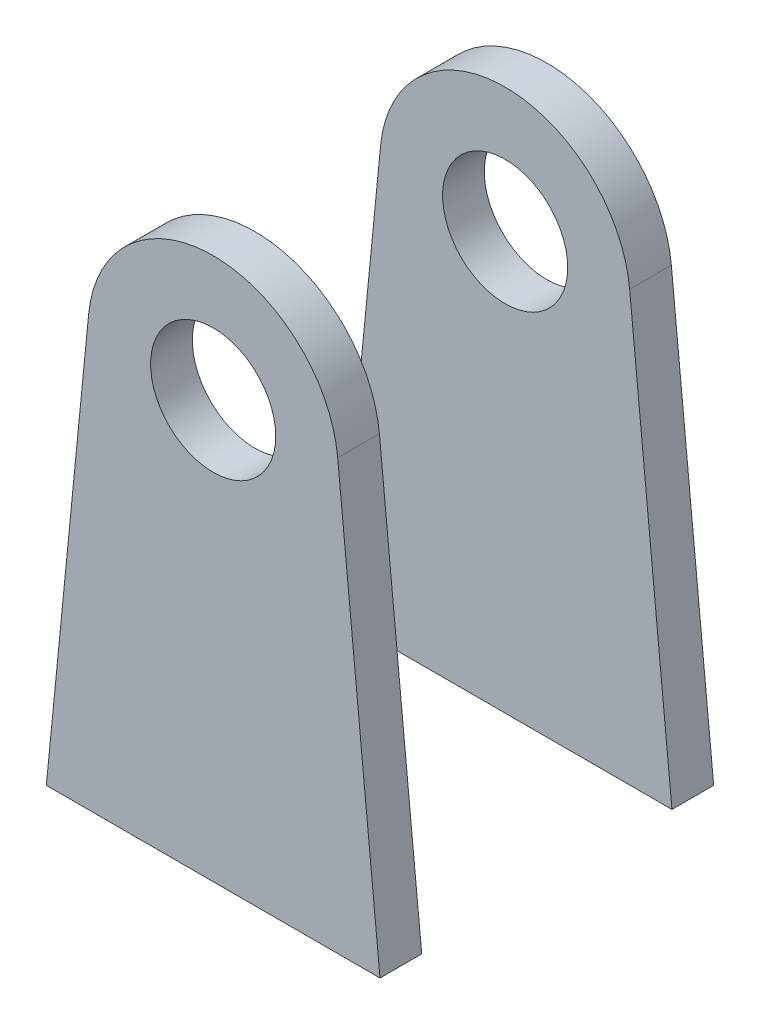
ISO-10303-21;
HEADER;
FILE_DESCRIPTION(('STEP AP214'),'2;1');
FILE_NAME('part.step','',(''),(''),'','','');
FILE_SCHEMA(('AUTOMOTIVE_DESIGN { 1 0 10303 214 1 1 1 1 }'));
ENDSEC;
DATA;
#1=APPLICATION_CONTEXT('core data for automotive mechanical design processes');
#2=APPLICATION_PROTOCOL_DEFINITION('international standard','automotive_design',2000,#1);
#3=PRODUCT_CONTEXT('',#1,'mechanical');
#4=PRODUCT('Part','Part','',(#3));
#5=PRODUCT_RELATED_PRODUCT_CATEGORY('part','',(#4));
#6=PRODUCT_DEFINITION_FORMATION('','',#4);
#7=PRODUCT_DEFINITION_CONTEXT('part definition',#1,'design');
#8=PRODUCT_DEFINITION('design','',#6,#7);
#9=PRODUCT_DEFINITION_SHAPE('','',#8);
#10=(LENGTH_UNIT() NAMED_UNIT(*) SI_UNIT(.MILLI.,.METRE.));
#11=(NAMED_UNIT(*) PLANE_ANGLE_UNIT() SI_UNIT($,.RADIAN.));
#12=(NAMED_UNIT(*) SI_UNIT($,.STERADIAN.) SOLID_ANGLE_UNIT());
#13=UNCERTAINTY_MEASURE_WITH_UNIT(LENGTH_MEASURE(1.E-05),#10,'distance_accuracy_value','');
#14=(GEOMETRIC_REPRESENTATION_CONTEXT(3) GLOBAL_UNCERTAINTY_ASSIGNED_CONTEXT((#13)) GLOBAL_UNIT_ASSIGNED_CONTEXT((#10,
#11,#12)) REPRESENTATION_CONTEXT('',''));
#15=CARTESIAN_POINT('',(0.,0.,0.));
#16=DIRECTION('',(0.,0.,1.));
#17=DIRECTION('',(1.,0.,0.));
#18=AXIS2_PLACEMENT_3D('',#15,#16,#17);
#19=CARTESIAN_POINT('',(-9.47908328640615,0.934133314562462,-9.525));
#20=DIRECTION('',(0.99517934765419,-0.0980717390616758,0.));
#21=DIRECTION('',(0.0980717390616758,0.99517934765419,0.));
#22=AXIS2_PLACEMENT_3D('',#19,#20,#21);
#23=PLANE('',#22);
#24=DIRECTION('',(-0.0980717390616758,-0.99517934765419,0.));
#25=VECTOR('',#24,1.);
#26=CARTESIAN_POINT('',(-9.47908328640615,0.934133314562462,-12.7));
#27=LINE('',#26,#25);
#28=CARTESIAN_POINT('',(-9.47908328640615,0.934133314562462,-12.7));
#29=VERTEX_POINT('',#28);
#30=CARTESIAN_POINT('',(-12.7,-31.75,-12.7));
#31=VERTEX_POINT('',#30);
#32=EDGE_CURVE('E129',#29,#31,#27,.T.);
#33=ORIENTED_EDGE('',*,*,#32,.T.);
#34=DIRECTION('',(0.,0.,-1.));
#35=VECTOR('',#34,1.);
#36=CARTESIAN_POINT('',(-12.7,-31.75,-9.525));
#37=LINE('',#36,#35);
#38=CARTESIAN_POINT('',(-12.7,-31.75,-9.525));
#39=VERTEX_POINT('',#38);
#40=EDGE_CURVE('E12',#39,#31,#37,.T.);
#41=ORIENTED_EDGE('',*,*,#40,.F.);
#42=DIRECTION('',(-0.0980717390616758,-0.99517934765419,0.));
#43=VECTOR('',#42,1.);
#44=CARTESIAN_POINT('',(-9.47908328640615,0.934133314562462,-9.525));
#45=LINE('',#44,#43);
#46=CARTESIAN_POINT('',(-9.47908328640615,0.934133314562462,-9.525));
#47=VERTEX_POINT('',#46);
#48=EDGE_CURVE('E106',#47,#39,#45,.T.);
#49=ORIENTED_EDGE('',*,*,#48,.F.);
#50=DIRECTION('',(0.,0.,-1.));
#51=VECTOR('',#50,1.);
#52=CARTESIAN_POINT('',(-9.47908328640615,0.934133314562462,-9.525));
#53=LINE('',#52,#51);
#54=EDGE_CURVE('E128',#47,#29,#53,.T.);
#55=ORIENTED_EDGE('',*,*,#54,.T.);
#56=EDGE_LOOP('',(#33,#41,#49,#55));
#57=FACE_BOUND('',#56,.T.);
#58=ADVANCED_FACE('F57',(#57),#23,.F.);
#59=CARTESIAN_POINT('',(0.,-31.75,-9.525));
#60=DIRECTION('',(0.,1.,0.));
#61=DIRECTION('',(0.,0.,1.));
#62=AXIS2_PLACEMENT_3D('',#59,#60,#61);
#63=PLANE('',#62);
#64=DIRECTION('',(1.,0.,0.));
#65=VECTOR('',#64,1.);
#66=CARTESIAN_POINT('',(0.,-31.75,-12.7));
#67=LINE('',#66,#65);
#68=CARTESIAN_POINT('',(12.7,-31.75,-12.7));
#69=VERTEX_POINT('',#68);
#70=EDGE_CURVE('E112',#31,#69,#67,.T.);
#71=ORIENTED_EDGE('',*,*,#70,.T.);
#72=DIRECTION('',(0.,0.,-1.));
#73=VECTOR('',#72,1.);
#74=CARTESIAN_POINT('',(12.7,-31.75,-9.525));
#75=LINE('',#74,#73);
#76=CARTESIAN_POINT('',(12.7,-31.75,-9.525));
#77=VERTEX_POINT('',#76);
#78=EDGE_CURVE('E66',#77,#69,#75,.T.);
#79=ORIENTED_EDGE('',*,*,#78,.F.);
#80=DIRECTION('',(1.,0.,0.));
#81=VECTOR('',#80,1.);
#82=CARTESIAN_POINT('',(0.,-31.75,-9.525));
#83=LINE('',#82,#81);
#84=EDGE_CURVE('E100',#39,#77,#83,.T.);
#85=ORIENTED_EDGE('',*,*,#84,.F.);
#86=ORIENTED_EDGE('',*,*,#40,.T.);
#87=EDGE_LOOP('',(#71,#79,#85,#86));
#88=FACE_BOUND('',#87,.T.);
#89=ADVANCED_FACE('F111',(#88),#63,.F.);
#90=CARTESIAN_POINT('',(9.47908328640615,0.934133314562464,-9.525));
#91=DIRECTION('',(0.99517934765419,0.098071739061676,0.));
#92=DIRECTION('',(-0.098071739061676,0.99517934765419,0.));
#93=AXIS2_PLACEMENT_3D('',#90,#91,#92);
#94=PLANE('',#93);
#95=DIRECTION('',(0.098071739061676,-0.99517934765419,0.));
#96=VECTOR('',#95,1.);
#97=CARTESIAN_POINT('',(9.47908328640615,0.934133314562464,-12.7));
#98=LINE('',#97,#96);
#99=CARTESIAN_POINT('',(9.47908328640615,0.934133314562464,-12.7));
#100=VERTEX_POINT('',#99);
#101=EDGE_CURVE('E135',#100,#69,#98,.T.);
#102=ORIENTED_EDGE('',*,*,#101,.F.);
#103=DIRECTION('',(0.,0.,-1.));
#104=VECTOR('',#103,1.);
#105=CARTESIAN_POINT('',(9.47908328640615,0.934133314562464,-9.525));
#106=LINE('',#105,#104);
#107=CARTESIAN_POINT('',(9.47908328640615,0.934133314562464,-9.525));
#108=VERTEX_POINT('',#107);
#109=EDGE_CURVE('E90',#108,#100,#106,.T.);
#110=ORIENTED_EDGE('',*,*,#109,.F.);
#111=DIRECTION('',(0.098071739061676,-0.99517934765419,0.));
#112=VECTOR('',#111,1.);
#113=CARTESIAN_POINT('',(9.47908328640615,0.934133314562464,-9.525));
#114=LINE('',#113,#112);
#115=EDGE_CURVE('E104',#108,#77,#114,.T.);
#116=ORIENTED_EDGE('',*,*,#115,.T.);
#117=ORIENTED_EDGE('',*,*,#78,.T.);
#118=EDGE_LOOP('',(#102,#110,#116,#117));
#119=FACE_BOUND('',#118,.T.);
#120=ADVANCED_FACE('F117',(#119),#94,.T.);
#121=CARTESIAN_POINT('',(0.,0.,-9.525));
#122=DIRECTION('',(0.,0.,-1.));
#123=DIRECTION('',(-1.,0.,0.));
#124=AXIS2_PLACEMENT_3D('',#121,#122,#123);
#125=CYLINDRICAL_SURFACE('',#124,9.525);
#126=CARTESIAN_POINT('',(0.,0.,-12.7));
#127=DIRECTION('',(0.,0.,1.));
#128=DIRECTION('',(1.,0.,0.));
#129=AXIS2_PLACEMENT_3D('',#126,#127,#128);
#130=CIRCLE('',#129,9.525);
#131=EDGE_CURVE('E93',#100,#29,#130,.T.);
#132=ORIENTED_EDGE('',*,*,#131,.T.);
#133=ORIENTED_EDGE('',*,*,#54,.F.);
#134=CARTESIAN_POINT('',(0.,0.,-9.525));
#135=DIRECTION('',(0.,0.,1.));
#136=DIRECTION('',(1.,0.,0.));
#137=AXIS2_PLACEMENT_3D('',#134,#135,#136);
#138=CIRCLE('',#137,9.525);
#139=EDGE_CURVE('E74',#108,#47,#138,.T.);
#140=ORIENTED_EDGE('',*,*,#139,.F.);
#141=ORIENTED_EDGE('',*,*,#109,.T.);
#142=EDGE_LOOP('',(#132,#133,#140,#141));
#143=FACE_BOUND('',#142,.T.);
#144=ADVANCED_FACE('F158',(#143),#125,.T.);
#145=CARTESIAN_POINT('',(0.,0.,-9.525));
#146=DIRECTION('',(0.,0.,-1.));
#147=DIRECTION('',(-1.,0.,0.));
#148=AXIS2_PLACEMENT_3D('',#145,#146,#147);
#149=CYLINDRICAL_SURFACE('',#148,4.7625);
#150=CARTESIAN_POINT('',(0.,0.,-9.525));
#151=DIRECTION('',(0.,0.,1.));
#152=DIRECTION('',(1.,0.,0.));
#153=AXIS2_PLACEMENT_3D('',#150,#151,#152);
#154=CIRCLE('',#153,4.7625);
#155=CARTESIAN_POINT('',(4.7625,0.,-9.525));
#156=VERTEX_POINT('',#155);
#157=EDGE_CURVE('E121',#156,#156,#154,.T.);
#158=ORIENTED_EDGE('',*,*,#157,.T.);
#159=EDGE_LOOP('',(#158));
#160=FACE_BOUND('',#159,.T.);
#161=CARTESIAN_POINT('',(0.,0.,-12.7));
#162=DIRECTION('',(0.,0.,1.));
#163=DIRECTION('',(1.,0.,0.));
#164=AXIS2_PLACEMENT_3D('',#161,#162,#163);
#165=CIRCLE('',#164,4.7625);
#166=CARTESIAN_POINT('',(4.7625,0.,-12.7));
#167=VERTEX_POINT('',#166);
#168=EDGE_CURVE('E140',#167,#167,#165,.T.);
#169=ORIENTED_EDGE('',*,*,#168,.F.);
#170=EDGE_LOOP('',(#169));
#171=FACE_BOUND('',#170,.T.);
#172=ADVANCED_FACE('F156',(#160,#171),#149,.F.);
#173=CARTESIAN_POINT('',(0.,0.,-9.525));
#174=DIRECTION('',(0.,0.,1.));
#175=DIRECTION('',(1.,0.,0.));
#176=AXIS2_PLACEMENT_3D('',#173,#174,#175);
#177=PLANE('',#176);
#178=ORIENTED_EDGE('',*,*,#48,.T.);
#179=ORIENTED_EDGE('',*,*,#84,.T.);
#180=ORIENTED_EDGE('',*,*,#115,.F.);
#181=ORIENTED_EDGE('',*,*,#139,.T.);
#182=EDGE_LOOP('',(#178,#179,#180,#181));
#183=FACE_BOUND('',#182,.T.);
#184=ORIENTED_EDGE('',*,*,#157,.F.);
#185=EDGE_LOOP('',(#184));
#186=FACE_BOUND('',#185,.T.);
#187=ADVANCED_FACE('F101',(#183,#186),#177,.T.);
#188=CARTESIAN_POINT('',(0.,0.,-12.7));
#189=DIRECTION('',(0.,0.,1.));
#190=DIRECTION('',(1.,0.,0.));
#191=AXIS2_PLACEMENT_3D('',#188,#189,#190);
#192=PLANE('',#191);
#193=ORIENTED_EDGE('',*,*,#32,.F.);
#194=ORIENTED_EDGE('',*,*,#131,.F.);
#195=ORIENTED_EDGE('',*,*,#101,.T.);
#196=ORIENTED_EDGE('',*,*,#70,.F.);
#197=EDGE_LOOP('',(#193,#194,#195,#196));
#198=FACE_BOUND('',#197,.T.);
#199=ORIENTED_EDGE('',*,*,#168,.T.);
#200=EDGE_LOOP('',(#199));
#201=FACE_BOUND('',#200,.T.);
#202=ADVANCED_FACE('F150',(#198,#201),#192,.F.);
#203=CLOSED_SHELL('',(#58,#89,#120,#144,#172,#187,#202));
#204=MANIFOLD_SOLID_BREP('B2',#203);
#205=CARTESIAN_POINT('',(-9.47908328640615,0.934133314562462,9.525));
#206=DIRECTION('',(-0.99517934765419,0.0980717390616758,0.));
#207=DIRECTION('',(-0.0980717390616758,-0.99517934765419,0.));
#208=AXIS2_PLACEMENT_3D('',#205,#206,#207);
#209=PLANE('',#208);
#210=DIRECTION('',(-0.0980717390616758,-0.99517934765419,0.));
#211=VECTOR('',#210,1.);
#212=CARTESIAN_POINT('',(-9.47908328640615,0.934133314562462,12.7));
#213=LINE('',#212,#211);
#214=CARTESIAN_POINT('',(-9.47908328640615,0.934133314562462,12.7));
#215=VERTEX_POINT('',#214);
#216=CARTESIAN_POINT('',(-12.7,-31.75,12.7));
#217=VERTEX_POINT('',#216);
#218=EDGE_CURVE('E303',#215,#217,#213,.T.);
#219=ORIENTED_EDGE('',*,*,#218,.F.);
#220=DIRECTION('',(0.,0.,1.));
#221=VECTOR('',#220,1.);
#222=CARTESIAN_POINT('',(-9.47908328640615,0.934133314562462,9.525));
#223=LINE('',#222,#221);
#224=CARTESIAN_POINT('',(-9.47908328640615,0.934133314562462,9.525));
#225=VERTEX_POINT('',#224);
#226=EDGE_CURVE('E55',#225,#215,#223,.T.);
#227=ORIENTED_EDGE('',*,*,#226,.F.);
#228=DIRECTION('',(-0.0980717390616758,-0.99517934765419,0.));
#229=VECTOR('',#228,1.);
#230=CARTESIAN_POINT('',(-9.47908328640615,0.934133314562462,9.525));
#231=LINE('',#230,#229);
#232=CARTESIAN_POINT('',(-12.7,-31.75,9.525));
#233=VERTEX_POINT('',#232);
#234=EDGE_CURVE('E291',#225,#233,#231,.T.);
#235=ORIENTED_EDGE('',*,*,#234,.T.);
#236=DIRECTION('',(0.,0.,1.));
#237=VECTOR('',#236,1.);
#238=CARTESIAN_POINT('',(-12.7,-31.75,9.525));
#239=LINE('',#238,#237);
#240=EDGE_CURVE('E231',#233,#217,#239,.T.);
#241=ORIENTED_EDGE('',*,*,#240,.T.);
#242=EDGE_LOOP('',(#219,#227,#235,#241));
#243=FACE_BOUND('',#242,.T.);
#244=ADVANCED_FACE('F228',(#243),#209,.T.);
#245=CARTESIAN_POINT('',(0.,0.,9.525));
#246=DIRECTION('',(0.,0.,1.));
#247=DIRECTION('',(1.,0.,0.));
#248=AXIS2_PLACEMENT_3D('',#245,#246,#247);
#249=CYLINDRICAL_SURFACE('',#248,9.525);
#250=CARTESIAN_POINT('',(0.,0.,12.7));
#251=DIRECTION('',(0.,0.,1.));
#252=DIRECTION('',(1.,0.,0.));
#253=AXIS2_PLACEMENT_3D('',#250,#251,#252);
#254=CIRCLE('',#253,9.525);
#255=CARTESIAN_POINT('',(9.47908328640615,0.934133314562464,12.7));
#256=VERTEX_POINT('',#255);
#257=EDGE_CURVE('E312',#256,#215,#254,.T.);
#258=ORIENTED_EDGE('',*,*,#257,.F.);
#259=DIRECTION('',(0.,0.,1.));
#260=VECTOR('',#259,1.);
#261=CARTESIAN_POINT('',(9.47908328640615,0.934133314562464,9.525));
#262=LINE('',#261,#260);
#263=CARTESIAN_POINT('',(9.47908328640615,0.934133314562464,9.525));
#264=VERTEX_POINT('',#263);
#265=EDGE_CURVE('E238',#264,#256,#262,.T.);
#266=ORIENTED_EDGE('',*,*,#265,.F.);
#267=CARTESIAN_POINT('',(0.,0.,9.525));
#268=DIRECTION('',(0.,0.,1.));
#269=DIRECTION('',(1.,0.,0.));
#270=AXIS2_PLACEMENT_3D('',#267,#268,#269);
#271=CIRCLE('',#270,9.525);
#272=EDGE_CURVE('E281',#264,#225,#271,.T.);
#273=ORIENTED_EDGE('',*,*,#272,.T.);
#274=ORIENTED_EDGE('',*,*,#226,.T.);
#275=EDGE_LOOP('',(#258,#266,#273,#274));
#276=FACE_BOUND('',#275,.T.);
#277=ADVANCED_FACE('F324',(#276),#249,.T.);
#278=CARTESIAN_POINT('',(9.47908328640615,0.934133314562464,9.525));
#279=DIRECTION('',(-0.99517934765419,-0.098071739061676,0.));
#280=DIRECTION('',(0.098071739061676,-0.99517934765419,0.));
#281=AXIS2_PLACEMENT_3D('',#278,#279,#280);
#282=PLANE('',#281);
#283=DIRECTION('',(0.098071739061676,-0.99517934765419,0.));
#284=VECTOR('',#283,1.);
#285=CARTESIAN_POINT('',(9.47908328640615,0.934133314562464,12.7));
#286=LINE('',#285,#284);
#287=CARTESIAN_POINT('',(12.7,-31.75,12.7));
#288=VERTEX_POINT('',#287);
#289=EDGE_CURVE('E286',#256,#288,#286,.T.);
#290=ORIENTED_EDGE('',*,*,#289,.T.);
#291=DIRECTION('',(0.,0.,1.));
#292=VECTOR('',#291,1.);
#293=CARTESIAN_POINT('',(12.7,-31.75,9.525));
#294=LINE('',#293,#292);
#295=CARTESIAN_POINT('',(12.7,-31.75,9.525));
#296=VERTEX_POINT('',#295);
#297=EDGE_CURVE('E284',#296,#288,#294,.T.);
#298=ORIENTED_EDGE('',*,*,#297,.F.);
#299=DIRECTION('',(0.098071739061676,-0.99517934765419,0.));
#300=VECTOR('',#299,1.);
#301=CARTESIAN_POINT('',(9.47908328640615,0.934133314562464,9.525));
#302=LINE('',#301,#300);
#303=EDGE_CURVE('E276',#264,#296,#302,.T.);
#304=ORIENTED_EDGE('',*,*,#303,.F.);
#305=ORIENTED_EDGE('',*,*,#265,.T.);
#306=EDGE_LOOP('',(#290,#298,#304,#305));
#307=FACE_BOUND('',#306,.T.);
#308=ADVANCED_FACE('F285',(#307),#282,.F.);
#309=CARTESIAN_POINT('',(0.,-31.75,9.525));
#310=DIRECTION('',(0.,-1.,0.));
#311=DIRECTION('',(0.,0.,-1.));
#312=AXIS2_PLACEMENT_3D('',#309,#310,#311);
#313=PLANE('',#312);
#314=DIRECTION('',(1.,0.,0.));
#315=VECTOR('',#314,1.);
#316=CARTESIAN_POINT('',(0.,-31.75,12.7));
#317=LINE('',#316,#315);
#318=EDGE_CURVE('E307',#217,#288,#317,.T.);
#319=ORIENTED_EDGE('',*,*,#318,.F.);
#320=ORIENTED_EDGE('',*,*,#240,.F.);
#321=DIRECTION('',(1.,0.,0.));
#322=VECTOR('',#321,1.);
#323=CARTESIAN_POINT('',(0.,-31.75,9.525));
#324=LINE('',#323,#322);
#325=EDGE_CURVE('E280',#233,#296,#324,.T.);
#326=ORIENTED_EDGE('',*,*,#325,.T.);
#327=ORIENTED_EDGE('',*,*,#297,.T.);
#328=EDGE_LOOP('',(#319,#320,#326,#327));
#329=FACE_BOUND('',#328,.T.);
#330=ADVANCED_FACE('F289',(#329),#313,.T.);
#331=CARTESIAN_POINT('',(0.,0.,9.525));
#332=DIRECTION('',(0.,0.,1.));
#333=DIRECTION('',(1.,0.,0.));
#334=AXIS2_PLACEMENT_3D('',#331,#332,#333);
#335=CYLINDRICAL_SURFACE('',#334,4.7625);
#336=CARTESIAN_POINT('',(0.,0.,9.525));
#337=DIRECTION('',(0.,0.,1.));
#338=DIRECTION('',(1.,0.,0.));
#339=AXIS2_PLACEMENT_3D('',#336,#337,#338);
#340=CIRCLE('',#339,4.7625);
#341=CARTESIAN_POINT('',(4.7625,0.,9.525));
#342=VERTEX_POINT('',#341);
#343=EDGE_CURVE('E299',#342,#342,#340,.T.);
#344=ORIENTED_EDGE('',*,*,#343,.F.);
#345=EDGE_LOOP('',(#344));
#346=FACE_BOUND('',#345,.T.);
#347=CARTESIAN_POINT('',(0.,0.,12.7));
#348=DIRECTION('',(0.,0.,1.));
#349=DIRECTION('',(1.,0.,0.));
#350=AXIS2_PLACEMENT_3D('',#347,#348,#349);
#351=CIRCLE('',#350,4.7625);
#352=CARTESIAN_POINT('',(4.7625,0.,12.7));
#353=VERTEX_POINT('',#352);
#354=EDGE_CURVE('E294',#353,#353,#351,.T.);
#355=ORIENTED_EDGE('',*,*,#354,.T.);
#356=EDGE_LOOP('',(#355));
#357=FACE_BOUND('',#356,.T.);
#358=ADVANCED_FACE('F333',(#346,#357),#335,.F.);
#359=CARTESIAN_POINT('',(0.,0.,9.525));
#360=DIRECTION('',(0.,0.,1.));
#361=DIRECTION('',(1.,0.,0.));
#362=AXIS2_PLACEMENT_3D('',#359,#360,#361);
#363=PLANE('',#362);
#364=ORIENTED_EDGE('',*,*,#234,.F.);
#365=ORIENTED_EDGE('',*,*,#272,.F.);
#366=ORIENTED_EDGE('',*,*,#303,.T.);
#367=ORIENTED_EDGE('',*,*,#325,.F.);
#368=EDGE_LOOP('',(#364,#365,#366,#367));
#369=FACE_BOUND('',#368,.T.);
#370=ORIENTED_EDGE('',*,*,#343,.T.);
#371=EDGE_LOOP('',(#370));
#372=FACE_BOUND('',#371,.T.);
#373=ADVANCED_FACE('F278',(#369,#372),#363,.F.);
#374=CARTESIAN_POINT('',(0.,0.,12.7));
#375=DIRECTION('',(0.,0.,1.));
#376=DIRECTION('',(1.,0.,0.));
#377=AXIS2_PLACEMENT_3D('',#374,#375,#376);
#378=PLANE('',#377);
#379=ORIENTED_EDGE('',*,*,#218,.T.);
#380=ORIENTED_EDGE('',*,*,#318,.T.);
#381=ORIENTED_EDGE('',*,*,#289,.F.);
#382=ORIENTED_EDGE('',*,*,#257,.T.);
#383=EDGE_LOOP('',(#379,#380,#381,#382));
#384=FACE_BOUND('',#383,.T.);
#385=ORIENTED_EDGE('',*,*,#354,.F.);
#386=EDGE_LOOP('',(#385));
#387=FACE_BOUND('',#386,.T.);
#388=ADVANCED_FACE('F322',(#384,#387),#378,.T.);
#389=CLOSED_SHELL('',(#244,#277,#308,#330,#358,#373,#388));
#390=MANIFOLD_SOLID_BREP('B6',#389);
#391=ADVANCED_BREP_SHAPE_REPRESENTATION('',(#18,#204,#390),#14);
#392=SHAPE_DEFINITION_REPRESENTATION(#9,#391);
ENDSEC;
END-ISO-10303-21;
